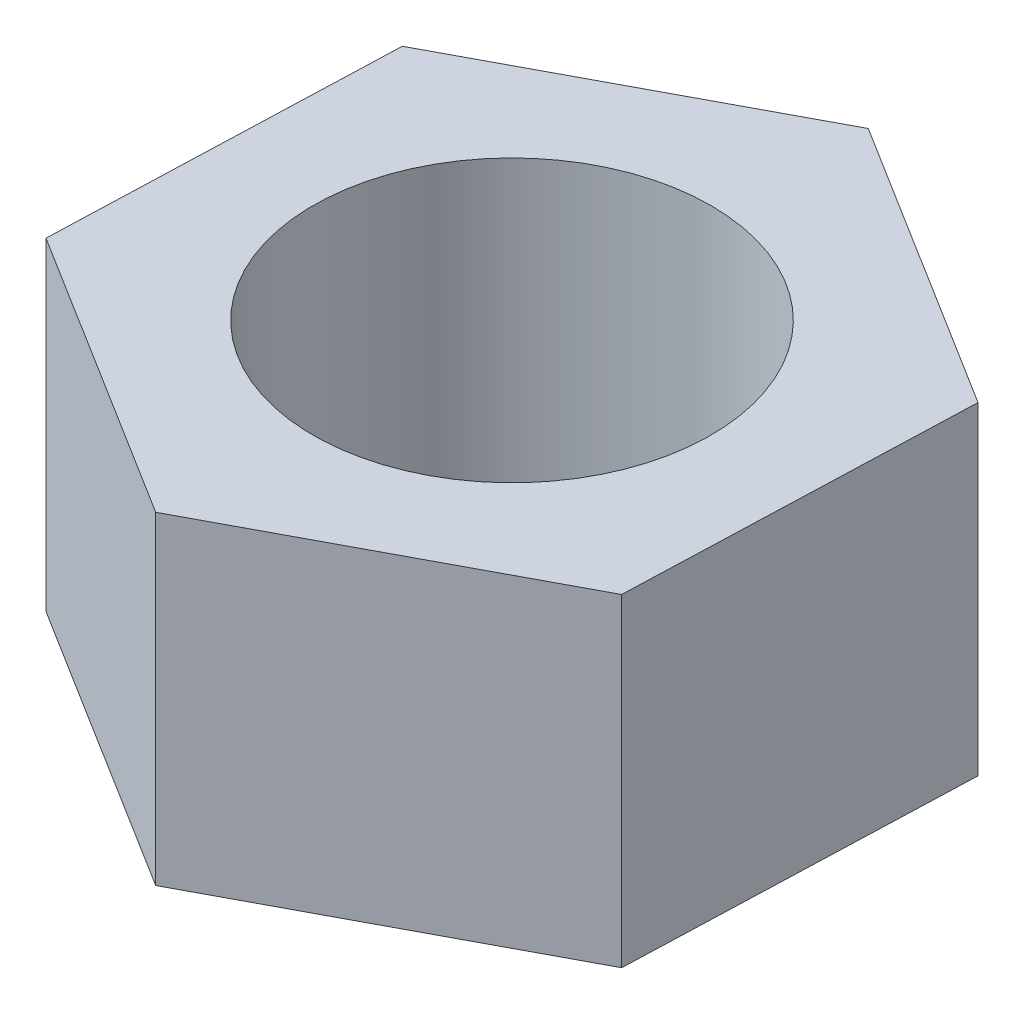
ISO-10303-21;
HEADER;
FILE_DESCRIPTION(('STEP AP214'),'2;1');
FILE_NAME('part.step','',(''),(''),'','','');
FILE_SCHEMA(('AUTOMOTIVE_DESIGN { 1 0 10303 214 1 1 1 1 }'));
ENDSEC;
DATA;
#1=APPLICATION_CONTEXT('core data for automotive mechanical design processes');
#2=APPLICATION_PROTOCOL_DEFINITION('international standard','automotive_design',2000,#1);
#3=PRODUCT_CONTEXT('',#1,'mechanical');
#4=PRODUCT('Part','Part','',(#3));
#5=PRODUCT_RELATED_PRODUCT_CATEGORY('part','',(#4));
#6=PRODUCT_DEFINITION_FORMATION('','',#4);
#7=PRODUCT_DEFINITION_CONTEXT('part definition',#1,'design');
#8=PRODUCT_DEFINITION('design','',#6,#7);
#9=PRODUCT_DEFINITION_SHAPE('','',#8);
#10=(LENGTH_UNIT() NAMED_UNIT(*) SI_UNIT(.MILLI.,.METRE.));
#11=(NAMED_UNIT(*) PLANE_ANGLE_UNIT() SI_UNIT($,.RADIAN.));
#12=(NAMED_UNIT(*) SI_UNIT($,.STERADIAN.) SOLID_ANGLE_UNIT());
#13=UNCERTAINTY_MEASURE_WITH_UNIT(LENGTH_MEASURE(1.E-05),#10,'distance_accuracy_value','');
#14=(GEOMETRIC_REPRESENTATION_CONTEXT(3) GLOBAL_UNCERTAINTY_ASSIGNED_CONTEXT((#13)) GLOBAL_UNIT_ASSIGNED_CONTEXT((#10,
#11,#12)) REPRESENTATION_CONTEXT('',''));
#15=CARTESIAN_POINT('',(0.,0.,0.));
#16=DIRECTION('',(0.,0.,1.));
#17=DIRECTION('',(1.,0.,0.));
#18=AXIS2_PLACEMENT_3D('',#15,#16,#17);
#19=CARTESIAN_POINT('',(0.,13.,0.));
#20=DIRECTION('',(0.,1.,0.));
#21=DIRECTION('',(0.,0.,1.));
#22=AXIS2_PLACEMENT_3D('',#19,#20,#21);
#23=PLANE('',#22);
#24=DIRECTION('',(0.0347672397183446,0.,-0.999395436772836));
#25=VECTOR('',#24,1.);
#26=CARTESIAN_POINT('',(11.7518707387496,13.,7.3412215699923));
#27=LINE('',#26,#25);
#28=CARTESIAN_POINT('',(11.7518707387496,13.,7.3412215699923));
#29=VERTEX_POINT('',#28);
#30=CARTESIAN_POINT('',(12.2336197437984,13.,-6.50680781675203));
#31=VERTEX_POINT('',#30);
#32=EDGE_CURVE('E130',#29,#31,#27,.T.);
#33=ORIENTED_EDGE('',*,*,#32,.T.);
#34=DIRECTION('',(-0.848118216812348,0.,-0.529807031201968));
#35=VECTOR('',#34,1.);
#36=CARTESIAN_POINT('',(12.2336197437984,13.,-6.50680781675203));
#37=LINE('',#36,#35);
#38=CARTESIAN_POINT('',(0.481749005048802,13.,-13.8480293867443));
#39=VERTEX_POINT('',#38);
#40=EDGE_CURVE('E88',#31,#39,#37,.T.);
#41=ORIENTED_EDGE('',*,*,#40,.T.);
#42=DIRECTION('',(-0.882885456530693,0.,0.469588405570868));
#43=VECTOR('',#42,1.);
#44=CARTESIAN_POINT('',(0.481749005048802,13.,-13.8480293867443));
#45=LINE('',#44,#43);
#46=CARTESIAN_POINT('',(-11.7518707387496,13.,-7.3412215699923));
#47=VERTEX_POINT('',#46);
#48=EDGE_CURVE('E101',#39,#47,#45,.T.);
#49=ORIENTED_EDGE('',*,*,#48,.T.);
#50=DIRECTION('',(-0.0347672397183448,0.,0.999395436772836));
#51=VECTOR('',#50,1.);
#52=CARTESIAN_POINT('',(-11.7518707387496,13.,-7.3412215699923));
#53=LINE('',#52,#51);
#54=CARTESIAN_POINT('',(-12.2336197437984,13.,6.50680781675202));
#55=VERTEX_POINT('',#54);
#56=EDGE_CURVE('E95',#47,#55,#53,.T.);
#57=ORIENTED_EDGE('',*,*,#56,.T.);
#58=DIRECTION('',(0.848118216812348,0.,0.529807031201968));
#59=VECTOR('',#58,1.);
#60=CARTESIAN_POINT('',(-12.2336197437984,13.,6.50680781675202));
#61=LINE('',#60,#59);
#62=CARTESIAN_POINT('',(-0.481749005048793,13.,13.8480293867443));
#63=VERTEX_POINT('',#62);
#64=EDGE_CURVE('E99',#55,#63,#61,.T.);
#65=ORIENTED_EDGE('',*,*,#64,.T.);
#66=DIRECTION('',(0.882885456530693,0.,-0.469588405570868));
#67=VECTOR('',#66,1.);
#68=CARTESIAN_POINT('',(-0.481749005048793,13.,13.8480293867443));
#69=LINE('',#68,#67);
#70=EDGE_CURVE('E51',#63,#29,#69,.T.);
#71=ORIENTED_EDGE('',*,*,#70,.T.);
#72=EDGE_LOOP('',(#33,#41,#49,#57,#65,#71));
#73=FACE_BOUND('',#72,.T.);
#74=CARTESIAN_POINT('',(0.,13.,0.));
#75=DIRECTION('',(0.,1.,0.));
#76=DIRECTION('',(0.,0.,1.));
#77=AXIS2_PLACEMENT_3D('',#74,#75,#76);
#78=CIRCLE('',#77,8.);
#79=CARTESIAN_POINT('',(0.,13.,-8.));
#80=VERTEX_POINT('',#79);
#81=EDGE_CURVE('E123',#80,#80,#78,.T.);
#82=ORIENTED_EDGE('',*,*,#81,.F.);
#83=EDGE_LOOP('',(#82));
#84=FACE_BOUND('',#83,.T.);
#85=ADVANCED_FACE('F34',(#73,#84),#23,.T.);
#86=CARTESIAN_POINT('',(0.,0.,0.));
#87=DIRECTION('',(0.,1.,0.));
#88=DIRECTION('',(0.,0.,1.));
#89=AXIS2_PLACEMENT_3D('',#86,#87,#88);
#90=PLANE('',#89);
#91=DIRECTION('',(0.0347672397183446,0.,-0.999395436772836));
#92=VECTOR('',#91,1.);
#93=CARTESIAN_POINT('',(11.7518707387496,0.,7.3412215699923));
#94=LINE('',#93,#92);
#95=CARTESIAN_POINT('',(11.7518707387496,0.,7.3412215699923));
#96=VERTEX_POINT('',#95);
#97=CARTESIAN_POINT('',(12.2336197437984,0.,-6.50680781675203));
#98=VERTEX_POINT('',#97);
#99=EDGE_CURVE('E119',#96,#98,#94,.T.);
#100=ORIENTED_EDGE('',*,*,#99,.F.);
#101=DIRECTION('',(0.882885456530693,0.,-0.469588405570868));
#102=VECTOR('',#101,1.);
#103=CARTESIAN_POINT('',(-0.481749005048793,0.,13.8480293867443));
#104=LINE('',#103,#102);
#105=CARTESIAN_POINT('',(-0.481749005048793,0.,13.8480293867443));
#106=VERTEX_POINT('',#105);
#107=EDGE_CURVE('E80',#106,#96,#104,.T.);
#108=ORIENTED_EDGE('',*,*,#107,.F.);
#109=DIRECTION('',(0.848118216812348,0.,0.529807031201968));
#110=VECTOR('',#109,1.);
#111=CARTESIAN_POINT('',(-12.2336197437984,0.,6.50680781675202));
#112=LINE('',#111,#110);
#113=CARTESIAN_POINT('',(-12.2336197437984,0.,6.50680781675202));
#114=VERTEX_POINT('',#113);
#115=EDGE_CURVE('E74',#114,#106,#112,.T.);
#116=ORIENTED_EDGE('',*,*,#115,.F.);
#117=DIRECTION('',(-0.0347672397183448,0.,0.999395436772836));
#118=VECTOR('',#117,1.);
#119=CARTESIAN_POINT('',(-11.7518707387496,0.,-7.3412215699923));
#120=LINE('',#119,#118);
#121=CARTESIAN_POINT('',(-11.7518707387496,0.,-7.3412215699923));
#122=VERTEX_POINT('',#121);
#123=EDGE_CURVE('E109',#122,#114,#120,.T.);
#124=ORIENTED_EDGE('',*,*,#123,.F.);
#125=DIRECTION('',(-0.882885456530693,0.,0.469588405570868));
#126=VECTOR('',#125,1.);
#127=CARTESIAN_POINT('',(0.481749005048802,0.,-13.8480293867443));
#128=LINE('',#127,#126);
#129=CARTESIAN_POINT('',(0.481749005048802,0.,-13.8480293867443));
#130=VERTEX_POINT('',#129);
#131=EDGE_CURVE('E125',#130,#122,#128,.T.);
#132=ORIENTED_EDGE('',*,*,#131,.F.);
#133=DIRECTION('',(-0.848118216812348,0.,-0.529807031201968));
#134=VECTOR('',#133,1.);
#135=CARTESIAN_POINT('',(12.2336197437984,0.,-6.50680781675203));
#136=LINE('',#135,#134);
#137=EDGE_CURVE('E122',#98,#130,#136,.T.);
#138=ORIENTED_EDGE('',*,*,#137,.F.);
#139=EDGE_LOOP('',(#100,#108,#116,#124,#132,#138));
#140=FACE_BOUND('',#139,.T.);
#141=CARTESIAN_POINT('',(0.,0.,0.));
#142=DIRECTION('',(0.,1.,0.));
#143=DIRECTION('',(0.,0.,1.));
#144=AXIS2_PLACEMENT_3D('',#141,#142,#143);
#145=CIRCLE('',#144,8.);
#146=CARTESIAN_POINT('',(0.,0.,-8.));
#147=VERTEX_POINT('',#146);
#148=EDGE_CURVE('E223',#147,#147,#145,.T.);
#149=ORIENTED_EDGE('',*,*,#148,.T.);
#150=EDGE_LOOP('',(#149));
#151=FACE_BOUND('',#150,.T.);
#152=ADVANCED_FACE('F139',(#140,#151),#90,.F.);
#153=CARTESIAN_POINT('',(11.7518707387496,13.,7.3412215699923));
#154=DIRECTION('',(-0.999395436772836,0.,-0.0347672397183446));
#155=DIRECTION('',(-0.0347672397183446,0.,0.999395436772836));
#156=AXIS2_PLACEMENT_3D('',#153,#154,#155);
#157=PLANE('',#156);
#158=ORIENTED_EDGE('',*,*,#99,.T.);
#159=DIRECTION('',(0.,-1.,0.));
#160=VECTOR('',#159,1.);
#161=CARTESIAN_POINT('',(12.2336197437984,13.,-6.50680781675203));
#162=LINE('',#161,#160);
#163=EDGE_CURVE('E11',#31,#98,#162,.T.);
#164=ORIENTED_EDGE('',*,*,#163,.F.);
#165=ORIENTED_EDGE('',*,*,#32,.F.);
#166=DIRECTION('',(0.,-1.,0.));
#167=VECTOR('',#166,1.);
#168=CARTESIAN_POINT('',(11.7518707387496,13.,7.3412215699923));
#169=LINE('',#168,#167);
#170=EDGE_CURVE('E115',#29,#96,#169,.T.);
#171=ORIENTED_EDGE('',*,*,#170,.T.);
#172=EDGE_LOOP('',(#158,#164,#165,#171));
#173=FACE_BOUND('',#172,.T.);
#174=ADVANCED_FACE('F36',(#173),#157,.F.);
#175=CARTESIAN_POINT('',(12.2336197437984,13.,-6.50680781675203));
#176=DIRECTION('',(-0.529807031201968,0.,0.848118216812348));
#177=DIRECTION('',(0.848118216812348,0.,0.529807031201968));
#178=AXIS2_PLACEMENT_3D('',#175,#176,#177);
#179=PLANE('',#178);
#180=ORIENTED_EDGE('',*,*,#137,.T.);
#181=DIRECTION('',(0.,-1.,0.));
#182=VECTOR('',#181,1.);
#183=CARTESIAN_POINT('',(0.481749005048802,13.,-13.8480293867443));
#184=LINE('',#183,#182);
#185=EDGE_CURVE('E43',#39,#130,#184,.T.);
#186=ORIENTED_EDGE('',*,*,#185,.F.);
#187=ORIENTED_EDGE('',*,*,#40,.F.);
#188=ORIENTED_EDGE('',*,*,#163,.T.);
#189=EDGE_LOOP('',(#180,#186,#187,#188));
#190=FACE_BOUND('',#189,.T.);
#191=ADVANCED_FACE('F164',(#190),#179,.F.);
#192=CARTESIAN_POINT('',(0.481749005048802,13.,-13.8480293867443));
#193=DIRECTION('',(0.469588405570868,0.,0.882885456530693));
#194=DIRECTION('',(0.882885456530693,0.,-0.469588405570868));
#195=AXIS2_PLACEMENT_3D('',#192,#193,#194);
#196=PLANE('',#195);
#197=ORIENTED_EDGE('',*,*,#131,.T.);
#198=DIRECTION('',(0.,-1.,0.));
#199=VECTOR('',#198,1.);
#200=CARTESIAN_POINT('',(-11.7518707387496,13.,-7.3412215699923));
#201=LINE('',#200,#199);
#202=EDGE_CURVE('E110',#47,#122,#201,.T.);
#203=ORIENTED_EDGE('',*,*,#202,.F.);
#204=ORIENTED_EDGE('',*,*,#48,.F.);
#205=ORIENTED_EDGE('',*,*,#185,.T.);
#206=EDGE_LOOP('',(#197,#203,#204,#205));
#207=FACE_BOUND('',#206,.T.);
#208=ADVANCED_FACE('F136',(#207),#196,.F.);
#209=CARTESIAN_POINT('',(-11.7518707387496,13.,-7.3412215699923));
#210=DIRECTION('',(0.999395436772836,0.,0.0347672397183447));
#211=DIRECTION('',(0.0347672397183447,0.,-0.999395436772836));
#212=AXIS2_PLACEMENT_3D('',#209,#210,#211);
#213=PLANE('',#212);
#214=ORIENTED_EDGE('',*,*,#123,.T.);
#215=DIRECTION('',(0.,-1.,0.));
#216=VECTOR('',#215,1.);
#217=CARTESIAN_POINT('',(-12.2336197437984,13.,6.50680781675202));
#218=LINE('',#217,#216);
#219=EDGE_CURVE('E106',#55,#114,#218,.T.);
#220=ORIENTED_EDGE('',*,*,#219,.F.);
#221=ORIENTED_EDGE('',*,*,#56,.F.);
#222=ORIENTED_EDGE('',*,*,#202,.T.);
#223=EDGE_LOOP('',(#214,#220,#221,#222));
#224=FACE_BOUND('',#223,.T.);
#225=ADVANCED_FACE('F107',(#224),#213,.F.);
#226=CARTESIAN_POINT('',(-12.2336197437984,13.,6.50680781675202));
#227=DIRECTION('',(0.529807031201968,0.,-0.848118216812348));
#228=DIRECTION('',(-0.848118216812348,0.,-0.529807031201968));
#229=AXIS2_PLACEMENT_3D('',#226,#227,#228);
#230=PLANE('',#229);
#231=ORIENTED_EDGE('',*,*,#115,.T.);
#232=DIRECTION('',(0.,-1.,0.));
#233=VECTOR('',#232,1.);
#234=CARTESIAN_POINT('',(-0.481749005048793,13.,13.8480293867443));
#235=LINE('',#234,#233);
#236=EDGE_CURVE('E111',#63,#106,#235,.T.);
#237=ORIENTED_EDGE('',*,*,#236,.F.);
#238=ORIENTED_EDGE('',*,*,#64,.F.);
#239=ORIENTED_EDGE('',*,*,#219,.T.);
#240=EDGE_LOOP('',(#231,#237,#238,#239));
#241=FACE_BOUND('',#240,.T.);
#242=ADVANCED_FACE('F113',(#241),#230,.F.);
#243=CARTESIAN_POINT('',(-0.481749005048793,13.,13.8480293867443));
#244=DIRECTION('',(-0.469588405570868,0.,-0.882885456530693));
#245=DIRECTION('',(-0.882885456530693,0.,0.469588405570868));
#246=AXIS2_PLACEMENT_3D('',#243,#244,#245);
#247=PLANE('',#246);
#248=ORIENTED_EDGE('',*,*,#107,.T.);
#249=ORIENTED_EDGE('',*,*,#170,.F.);
#250=ORIENTED_EDGE('',*,*,#70,.F.);
#251=ORIENTED_EDGE('',*,*,#236,.T.);
#252=EDGE_LOOP('',(#248,#249,#250,#251));
#253=FACE_BOUND('',#252,.T.);
#254=ADVANCED_FACE('F144',(#253),#247,.F.);
#255=CARTESIAN_POINT('',(0.,13.,0.));
#256=DIRECTION('',(0.,-1.,0.));
#257=DIRECTION('',(0.,0.,-1.));
#258=AXIS2_PLACEMENT_3D('',#255,#256,#257);
#259=CYLINDRICAL_SURFACE('',#258,8.);
#260=CARTESIAN_POINT('',(0.,13.,-8.));
#261=CARTESIAN_POINT('',(0.,12.8645833333333,-8.));
#262=CARTESIAN_POINT('',(0.,12.7291666666667,-8.));
#263=CARTESIAN_POINT('',(0.,12.4583333333333,-8.));
#264=CARTESIAN_POINT('',(0.,12.3229166666667,-8.));
#265=CARTESIAN_POINT('',(0.,12.0520833333333,-8.));
#266=CARTESIAN_POINT('',(0.,11.9166666666667,-8.));
#267=CARTESIAN_POINT('',(0.,11.6458333333333,-8.));
#268=CARTESIAN_POINT('',(0.,11.5104166666667,-8.));
#269=CARTESIAN_POINT('',(0.,11.2395833333333,-8.));
#270=CARTESIAN_POINT('',(0.,11.1041666666667,-8.));
#271=CARTESIAN_POINT('',(0.,10.8333333333333,-8.));
#272=CARTESIAN_POINT('',(0.,10.6979166666667,-8.));
#273=CARTESIAN_POINT('',(0.,10.4270833333333,-8.));
#274=CARTESIAN_POINT('',(0.,10.2916666666667,-8.));
#275=CARTESIAN_POINT('',(0.,10.0208333333333,-8.));
#276=CARTESIAN_POINT('',(0.,9.88541666666667,-8.));
#277=CARTESIAN_POINT('',(0.,9.61458333333333,-8.));
#278=CARTESIAN_POINT('',(0.,9.47916666666667,-8.));
#279=CARTESIAN_POINT('',(0.,9.20833333333333,-8.));
#280=CARTESIAN_POINT('',(0.,9.07291666666666,-8.));
#281=CARTESIAN_POINT('',(0.,8.80208333333333,-8.));
#282=CARTESIAN_POINT('',(0.,8.66666666666667,-8.));
#283=CARTESIAN_POINT('',(0.,8.39583333333333,-8.));
#284=CARTESIAN_POINT('',(0.,8.26041666666667,-8.));
#285=CARTESIAN_POINT('',(0.,7.98958333333333,-8.));
#286=CARTESIAN_POINT('',(0.,7.85416666666667,-8.));
#287=CARTESIAN_POINT('',(0.,7.58333333333333,-8.));
#288=CARTESIAN_POINT('',(0.,7.44791666666667,-8.));
#289=CARTESIAN_POINT('',(0.,7.17708333333333,-8.));
#290=CARTESIAN_POINT('',(0.,7.04166666666667,-8.));
#291=CARTESIAN_POINT('',(0.,6.77083333333333,-8.));
#292=CARTESIAN_POINT('',(0.,6.63541666666667,-8.));
#293=CARTESIAN_POINT('',(0.,6.36458333333333,-8.));
#294=CARTESIAN_POINT('',(0.,6.22916666666667,-8.));
#295=CARTESIAN_POINT('',(0.,5.95833333333333,-8.));
#296=CARTESIAN_POINT('',(0.,5.82291666666667,-8.));
#297=CARTESIAN_POINT('',(0.,5.55208333333333,-8.));
#298=CARTESIAN_POINT('',(0.,5.41666666666667,-8.));
#299=CARTESIAN_POINT('',(0.,5.14583333333333,-8.));
#300=CARTESIAN_POINT('',(0.,5.01041666666667,-8.));
#301=CARTESIAN_POINT('',(0.,4.73958333333333,-8.));
#302=CARTESIAN_POINT('',(0.,4.60416666666667,-8.));
#303=CARTESIAN_POINT('',(0.,4.33333333333333,-8.));
#304=CARTESIAN_POINT('',(0.,4.19791666666667,-8.));
#305=CARTESIAN_POINT('',(0.,3.92708333333333,-8.));
#306=CARTESIAN_POINT('',(0.,3.79166666666667,-8.));
#307=CARTESIAN_POINT('',(0.,3.52083333333333,-8.));
#308=CARTESIAN_POINT('',(0.,3.38541666666667,-8.));
#309=CARTESIAN_POINT('',(0.,3.11458333333333,-8.));
#310=CARTESIAN_POINT('',(0.,2.97916666666667,-8.));
#311=CARTESIAN_POINT('',(0.,2.70833333333333,-8.));
#312=CARTESIAN_POINT('',(0.,2.57291666666667,-8.));
#313=CARTESIAN_POINT('',(0.,2.30208333333333,-8.));
#314=CARTESIAN_POINT('',(0.,2.16666666666667,-8.));
#315=CARTESIAN_POINT('',(0.,1.89583333333333,-8.));
#316=CARTESIAN_POINT('',(0.,1.76041666666667,-8.));
#317=CARTESIAN_POINT('',(0.,1.48958333333333,-8.));
#318=CARTESIAN_POINT('',(0.,1.35416666666667,-8.));
#319=CARTESIAN_POINT('',(0.,1.08333333333333,-8.));
#320=CARTESIAN_POINT('',(0.,0.947916666666667,-8.));
#321=CARTESIAN_POINT('',(0.,0.677083333333334,-8.));
#322=CARTESIAN_POINT('',(0.,0.541666666666667,-8.));
#323=CARTESIAN_POINT('',(0.,0.270833333333334,-8.));
#324=CARTESIAN_POINT('',(0.,0.135416666666667,-8.));
#325=CARTESIAN_POINT('',(0.,0.,-8.));
#326=B_SPLINE_CURVE_WITH_KNOTS('',3,(#260,#261,#262,#263,#264,#265,#266,#267,#268,#269,#270,
#271,#272,#273,#274,#275,#276,#277,#278,#279,#280,#281,#282,#283,#284,#285,#286,#287,#288,#289,
#290,#291,#292,#293,#294,#295,#296,#297,#298,#299,#300,#301,#302,#303,#304,#305,#306,#307,#308,
#309,#310,#311,#312,#313,#314,#315,#316,#317,#318,#319,#320,#321,#322,#323,#324,#325),
.UNSPECIFIED.,.F.,.F.,(4,2,2,2,2,2,2,2,2,2,2,2,2,2,2,2,2,2,2,2,2,2,2,2,2,2,2,2,2,2,2,2,4),(0.,
0.40625,0.812500000000001,1.21875,1.625,2.03125,2.4375,2.84375,3.25,3.65625,4.0625,4.46875,
4.875,5.28125,5.6875,6.09375,6.5,6.90625,7.3125,7.71875,8.125,8.53125,8.9375,9.34375,9.75,
10.15625,10.5625,10.96875,11.375,11.78125,12.1875,12.59375,13.),.UNSPECIFIED.);
#327=EDGE_CURVE('BSEAM146',#80,#147,#326,.T.);
#328=ORIENTED_EDGE('',*,*,#81,.T.);
#329=ORIENTED_EDGE('',*,*,#148,.F.);
#330=ORIENTED_EDGE('',*,*,#327,.T.);
#331=ORIENTED_EDGE('',*,*,#327,.F.);
#332=EDGE_LOOP('',(#328,#330,#329,#331));
#333=FACE_BOUND('',#332,.T.);
#334=ADVANCED_FACE('F146',(#333),#259,.F.);
#335=CLOSED_SHELL('',(#85,#152,#174,#191,#208,#225,#242,#254,#334));
#336=MANIFOLD_SOLID_BREP('B2',#335);
#337=ADVANCED_BREP_SHAPE_REPRESENTATION('',(#18,#336),#14);
#338=SHAPE_DEFINITION_REPRESENTATION(#9,#337);
ENDSEC;
END-ISO-10303-21;
